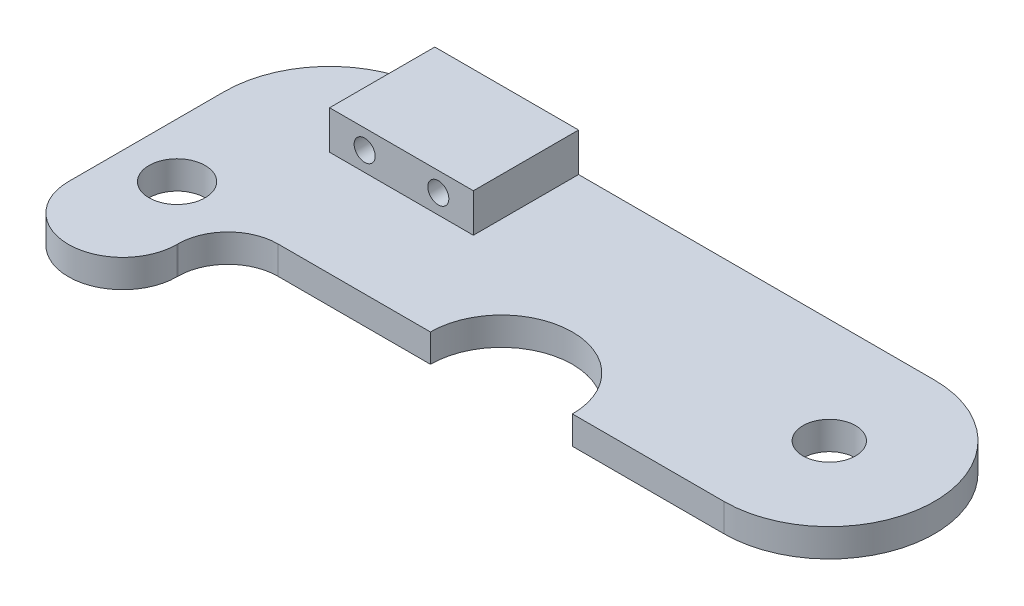
ISO-10303-21;
HEADER;
FILE_DESCRIPTION(('STEP AP214'),'2;1');
FILE_NAME('part.step','',(''),(''),'','','');
FILE_SCHEMA(('AUTOMOTIVE_DESIGN { 1 0 10303 214 1 1 1 1 }'));
ENDSEC;
DATA;
#1=APPLICATION_CONTEXT('core data for automotive mechanical design processes');
#2=APPLICATION_PROTOCOL_DEFINITION('international standard','automotive_design',2000,#1);
#3=PRODUCT_CONTEXT('',#1,'mechanical');
#4=PRODUCT('Part','Part','',(#3));
#5=PRODUCT_RELATED_PRODUCT_CATEGORY('part','',(#4));
#6=PRODUCT_DEFINITION_FORMATION('','',#4);
#7=PRODUCT_DEFINITION_CONTEXT('part definition',#1,'design');
#8=PRODUCT_DEFINITION('design','',#6,#7);
#9=PRODUCT_DEFINITION_SHAPE('','',#8);
#10=(LENGTH_UNIT() NAMED_UNIT(*) SI_UNIT(.MILLI.,.METRE.));
#11=(NAMED_UNIT(*) PLANE_ANGLE_UNIT() SI_UNIT($,.RADIAN.));
#12=(NAMED_UNIT(*) SI_UNIT($,.STERADIAN.) SOLID_ANGLE_UNIT());
#13=UNCERTAINTY_MEASURE_WITH_UNIT(LENGTH_MEASURE(1.E-05),#10,'distance_accuracy_value','');
#14=(GEOMETRIC_REPRESENTATION_CONTEXT(3) GLOBAL_UNCERTAINTY_ASSIGNED_CONTEXT((#13)) GLOBAL_UNIT_ASSIGNED_CONTEXT((#10,
#11,#12)) REPRESENTATION_CONTEXT('',''));
#15=CARTESIAN_POINT('',(0.,0.,0.));
#16=DIRECTION('',(0.,0.,1.));
#17=DIRECTION('',(1.,0.,0.));
#18=AXIS2_PLACEMENT_3D('',#15,#16,#17);
#19=CARTESIAN_POINT('',(-12.8703818547243,8.8,-15.7021496849741));
#20=DIRECTION('',(0.,1.,0.));
#21=DIRECTION('',(0.,0.,1.));
#22=AXIS2_PLACEMENT_3D('',#19,#20,#21);
#23=PLANE('',#22);
#24=DIRECTION('',(0.,0.,1.));
#25=VECTOR('',#24,1.);
#26=CARTESIAN_POINT('',(-12.8703818547243,8.8,-21.7021496849741));
#27=LINE('',#26,#25);
#28=CARTESIAN_POINT('',(-12.8703818547243,8.8,-21.7021496849741));
#29=VERTEX_POINT('',#28);
#30=CARTESIAN_POINT('',(-12.8703818547243,8.8,-15.7021496849741));
#31=VERTEX_POINT('',#30);
#32=EDGE_CURVE('E154',#29,#31,#27,.T.);
#33=ORIENTED_EDGE('',*,*,#32,.F.);
#34=CARTESIAN_POINT('',(-12.8703818547243,8.8,-15.7021496849741));
#35=DIRECTION('',(0.,1.,0.));
#36=DIRECTION('',(0.,0.,1.));
#37=AXIS2_PLACEMENT_3D('',#34,#35,#36);
#38=CIRCLE('',#37,6.);
#39=CARTESIAN_POINT('',(-18.8703818547243,8.8,-15.7021496849741));
#40=VERTEX_POINT('',#39);
#41=EDGE_CURVE('E173',#29,#40,#38,.T.);
#42=ORIENTED_EDGE('',*,*,#41,.T.);
#43=DIRECTION('',(0.,0.,1.));
#44=VECTOR('',#43,1.);
#45=CARTESIAN_POINT('',(-18.8703818547243,8.8,-9.70214968497411));
#46=LINE('',#45,#44);
#47=CARTESIAN_POINT('',(-18.8703818547243,8.8,-6.80214968497411));
#48=VERTEX_POINT('',#47);
#49=EDGE_CURVE('E176',#40,#48,#46,.T.);
#50=ORIENTED_EDGE('',*,*,#49,.T.);
#51=CARTESIAN_POINT('',(-15.7703818547243,8.8,-6.80214968497411));
#52=DIRECTION('',(0.,1.,0.));
#53=DIRECTION('',(0.,0.,1.));
#54=AXIS2_PLACEMENT_3D('',#51,#52,#53);
#55=CIRCLE('',#54,3.1);
#56=CARTESIAN_POINT('',(-12.6703818547243,8.8,-6.80214968497411));
#57=VERTEX_POINT('',#56);
#58=EDGE_CURVE('E179',#48,#57,#55,.T.);
#59=ORIENTED_EDGE('',*,*,#58,.T.);
#60=DIRECTION('',(0.,0.,-1.));
#61=VECTOR('',#60,1.);
#62=CARTESIAN_POINT('',(-12.6703818547243,8.8,-6.85214968497411));
#63=LINE('',#62,#61);
#64=CARTESIAN_POINT('',(-12.6703818547243,8.8,-6.85214968497411));
#65=VERTEX_POINT('',#64);
#66=EDGE_CURVE('E181',#57,#65,#63,.T.);
#67=ORIENTED_EDGE('',*,*,#66,.T.);
#68=CARTESIAN_POINT('',(-9.82038185472429,8.8,-6.85214968497411));
#69=DIRECTION('',(0.,-1.,0.));
#70=DIRECTION('',(0.,0.,1.));
#71=AXIS2_PLACEMENT_3D('',#68,#69,#70);
#72=CIRCLE('',#71,2.85);
#73=CARTESIAN_POINT('',(-9.82038185472429,8.8,-9.70214968497411));
#74=VERTEX_POINT('',#73);
#75=EDGE_CURVE('E183',#65,#74,#72,.T.);
#76=ORIENTED_EDGE('',*,*,#75,.T.);
#77=DIRECTION('',(1.,0.,0.));
#78=VECTOR('',#77,1.);
#79=CARTESIAN_POINT('',(-9.82038185472429,8.8,-9.70214968497411));
#80=LINE('',#79,#78);
#81=CARTESIAN_POINT('',(-1.12038185472429,8.8,-9.70214968497411));
#82=VERTEX_POINT('',#81);
#83=EDGE_CURVE('E185',#74,#82,#80,.T.);
#84=ORIENTED_EDGE('',*,*,#83,.T.);
#85=CARTESIAN_POINT('',(2.92961814527571,8.8,-9.70214968497411));
#86=DIRECTION('',(0.,-1.,0.));
#87=DIRECTION('',(0.,0.,1.));
#88=AXIS2_PLACEMENT_3D('',#85,#86,#87);
#89=CIRCLE('',#88,4.05);
#90=CARTESIAN_POINT('',(6.97961814527571,8.8,-9.70214968497411));
#91=VERTEX_POINT('',#90);
#92=EDGE_CURVE('E187',#82,#91,#89,.T.);
#93=ORIENTED_EDGE('',*,*,#92,.T.);
#94=DIRECTION('',(1.,0.,0.));
#95=VECTOR('',#94,1.);
#96=CARTESIAN_POINT('',(6.97961814527571,8.8,-9.70214968497411));
#97=LINE('',#96,#95);
#98=CARTESIAN_POINT('',(15.6296181452757,8.8,-9.70214968497411));
#99=VERTEX_POINT('',#98);
#100=EDGE_CURVE('E189',#91,#99,#97,.T.);
#101=ORIENTED_EDGE('',*,*,#100,.T.);
#102=CARTESIAN_POINT('',(15.6296181452757,8.8,-15.7021496849741));
#103=DIRECTION('',(0.,1.,0.));
#104=DIRECTION('',(0.,0.,1.));
#105=AXIS2_PLACEMENT_3D('',#102,#103,#104);
#106=CIRCLE('',#105,6.);
#107=CARTESIAN_POINT('',(15.6296181452757,8.8,-21.7021496849741));
#108=VERTEX_POINT('',#107);
#109=EDGE_CURVE('E191',#99,#108,#106,.T.);
#110=ORIENTED_EDGE('',*,*,#109,.T.);
#111=DIRECTION('',(-1.,0.,0.));
#112=VECTOR('',#111,1.);
#113=CARTESIAN_POINT('',(-12.8703818547243,8.8,-21.7021496849741));
#114=LINE('',#113,#112);
#115=CARTESIAN_POINT('',(-4.6703818547243,8.8,-21.7021496849741));
#116=VERTEX_POINT('',#115);
#117=EDGE_CURVE('E56',#108,#116,#114,.T.);
#118=ORIENTED_EDGE('',*,*,#117,.T.);
#119=DIRECTION('',(0.,0.,-1.));
#120=VECTOR('',#119,1.);
#121=CARTESIAN_POINT('',(-4.6703818547243,8.8,-21.7021496849741));
#122=LINE('',#121,#120);
#123=CARTESIAN_POINT('',(-4.67038185472429,8.8,-15.7021496849741));
#124=VERTEX_POINT('',#123);
#125=EDGE_CURVE('E151',#124,#116,#122,.T.);
#126=ORIENTED_EDGE('',*,*,#125,.F.);
#127=DIRECTION('',(1.,0.,0.));
#128=VECTOR('',#127,1.);
#129=CARTESIAN_POINT('',(-12.8703818547243,8.8,-15.7021496849741));
#130=LINE('',#129,#128);
#131=EDGE_CURVE('E50',#31,#124,#130,.T.);
#132=ORIENTED_EDGE('',*,*,#131,.F.);
#133=EDGE_LOOP('',(#33,#42,#50,#59,#67,#76,#84,#93,#101,#110,#118,#126,#132));
#134=FACE_BOUND('',#133,.T.);
#135=CARTESIAN_POINT('',(15.6296181452757,8.8,-15.7021496849741));
#136=DIRECTION('',(0.,1.,0.));
#137=DIRECTION('',(0.,0.,1.));
#138=AXIS2_PLACEMENT_3D('',#135,#136,#137);
#139=CIRCLE('',#138,1.5);
#140=CARTESIAN_POINT('',(15.6296181452757,8.8,-14.2021496849741));
#141=VERTEX_POINT('',#140);
#142=EDGE_CURVE('E167',#141,#141,#139,.T.);
#143=ORIENTED_EDGE('',*,*,#142,.F.);
#144=EDGE_LOOP('',(#143));
#145=FACE_BOUND('',#144,.T.);
#146=CARTESIAN_POINT('',(-15.7703818547243,8.8,-9.90214968497411));
#147=DIRECTION('',(0.,1.,0.));
#148=DIRECTION('',(0.,0.,1.));
#149=AXIS2_PLACEMENT_3D('',#146,#147,#148);
#150=CIRCLE('',#149,1.6);
#151=CARTESIAN_POINT('',(-15.7703818547243,8.8,-8.30214968497411));
#152=VERTEX_POINT('',#151);
#153=EDGE_CURVE('E158',#152,#152,#150,.T.);
#154=ORIENTED_EDGE('',*,*,#153,.F.);
#155=EDGE_LOOP('',(#154));
#156=FACE_BOUND('',#155,.T.);
#157=ADVANCED_FACE('F35',(#134,#145,#156),#23,.T.);
#158=CARTESIAN_POINT('',(-12.8703818547243,7.2,-15.7021496849741));
#159=DIRECTION('',(0.,1.,0.));
#160=DIRECTION('',(0.,0.,1.));
#161=AXIS2_PLACEMENT_3D('',#158,#159,#160);
#162=PLANE('',#161);
#163=CARTESIAN_POINT('',(-12.8703818547243,7.2,-15.7021496849741));
#164=DIRECTION('',(0.,1.,0.));
#165=DIRECTION('',(0.,0.,1.));
#166=AXIS2_PLACEMENT_3D('',#163,#164,#165);
#167=CIRCLE('',#166,6.);
#168=CARTESIAN_POINT('',(-12.8703818547243,7.2,-21.7021496849741));
#169=VERTEX_POINT('',#168);
#170=CARTESIAN_POINT('',(-18.8703818547243,7.2,-15.7021496849741));
#171=VERTEX_POINT('',#170);
#172=EDGE_CURVE('E170',#169,#171,#167,.T.);
#173=ORIENTED_EDGE('',*,*,#172,.F.);
#174=DIRECTION('',(-1.,0.,0.));
#175=VECTOR('',#174,1.);
#176=CARTESIAN_POINT('',(-12.8703818547243,7.2,-21.7021496849741));
#177=LINE('',#176,#175);
#178=CARTESIAN_POINT('',(15.6296181452757,7.2,-21.7021496849741));
#179=VERTEX_POINT('',#178);
#180=EDGE_CURVE('E177',#179,#169,#177,.T.);
#181=ORIENTED_EDGE('',*,*,#180,.F.);
#182=CARTESIAN_POINT('',(15.6296181452757,7.2,-15.7021496849741));
#183=DIRECTION('',(0.,1.,0.));
#184=DIRECTION('',(0.,0.,1.));
#185=AXIS2_PLACEMENT_3D('',#182,#183,#184);
#186=CIRCLE('',#185,6.);
#187=CARTESIAN_POINT('',(15.6296181452757,7.2,-9.70214968497411));
#188=VERTEX_POINT('',#187);
#189=EDGE_CURVE('E211',#188,#179,#186,.T.);
#190=ORIENTED_EDGE('',*,*,#189,.F.);
#191=DIRECTION('',(1.,0.,0.));
#192=VECTOR('',#191,1.);
#193=CARTESIAN_POINT('',(6.97961814527571,7.2,-9.70214968497411));
#194=LINE('',#193,#192);
#195=CARTESIAN_POINT('',(6.97961814527571,7.2,-9.70214968497411));
#196=VERTEX_POINT('',#195);
#197=EDGE_CURVE('E209',#196,#188,#194,.T.);
#198=ORIENTED_EDGE('',*,*,#197,.F.);
#199=CARTESIAN_POINT('',(2.92961814527571,7.2,-9.70214968497411));
#200=DIRECTION('',(0.,-1.,0.));
#201=DIRECTION('',(0.,0.,1.));
#202=AXIS2_PLACEMENT_3D('',#199,#200,#201);
#203=CIRCLE('',#202,4.05);
#204=CARTESIAN_POINT('',(-1.12038185472429,7.2,-9.70214968497411));
#205=VERTEX_POINT('',#204);
#206=EDGE_CURVE('E207',#205,#196,#203,.T.);
#207=ORIENTED_EDGE('',*,*,#206,.F.);
#208=DIRECTION('',(1.,0.,0.));
#209=VECTOR('',#208,1.);
#210=CARTESIAN_POINT('',(-9.82038185472429,7.2,-9.70214968497411));
#211=LINE('',#210,#209);
#212=CARTESIAN_POINT('',(-9.82038185472429,7.2,-9.70214968497411));
#213=VERTEX_POINT('',#212);
#214=EDGE_CURVE('E205',#213,#205,#211,.T.);
#215=ORIENTED_EDGE('',*,*,#214,.F.);
#216=CARTESIAN_POINT('',(-9.82038185472429,7.2,-6.85214968497411));
#217=DIRECTION('',(0.,-1.,0.));
#218=DIRECTION('',(0.,0.,1.));
#219=AXIS2_PLACEMENT_3D('',#216,#217,#218);
#220=CIRCLE('',#219,2.85);
#221=CARTESIAN_POINT('',(-12.6703818547243,7.2,-6.85214968497411));
#222=VERTEX_POINT('',#221);
#223=EDGE_CURVE('E203',#222,#213,#220,.T.);
#224=ORIENTED_EDGE('',*,*,#223,.F.);
#225=DIRECTION('',(0.,0.,-1.));
#226=VECTOR('',#225,1.);
#227=CARTESIAN_POINT('',(-12.6703818547243,7.2,-6.85214968497411));
#228=LINE('',#227,#226);
#229=CARTESIAN_POINT('',(-12.6703818547243,7.2,-6.80214968497411));
#230=VERTEX_POINT('',#229);
#231=EDGE_CURVE('E201',#230,#222,#228,.T.);
#232=ORIENTED_EDGE('',*,*,#231,.F.);
#233=CARTESIAN_POINT('',(-15.7703818547243,7.2,-6.80214968497411));
#234=DIRECTION('',(0.,1.,0.));
#235=DIRECTION('',(0.,0.,1.));
#236=AXIS2_PLACEMENT_3D('',#233,#234,#235);
#237=CIRCLE('',#236,3.1);
#238=CARTESIAN_POINT('',(-18.8703818547243,7.2,-6.80214968497411));
#239=VERTEX_POINT('',#238);
#240=EDGE_CURVE('E199',#239,#230,#237,.T.);
#241=ORIENTED_EDGE('',*,*,#240,.F.);
#242=DIRECTION('',(0.,0.,1.));
#243=VECTOR('',#242,1.);
#244=CARTESIAN_POINT('',(-18.8703818547243,7.2,-9.70214968497411));
#245=LINE('',#244,#243);
#246=EDGE_CURVE('E197',#171,#239,#245,.T.);
#247=ORIENTED_EDGE('',*,*,#246,.F.);
#248=EDGE_LOOP('',(#173,#181,#190,#198,#207,#215,#224,#232,#241,#247));
#249=FACE_BOUND('',#248,.T.);
#250=CARTESIAN_POINT('',(15.6296181452757,7.2,-15.7021496849741));
#251=DIRECTION('',(0.,1.,0.));
#252=DIRECTION('',(0.,0.,1.));
#253=AXIS2_PLACEMENT_3D('',#250,#251,#252);
#254=CIRCLE('',#253,1.5);
#255=CARTESIAN_POINT('',(15.6296181452757,7.2,-14.2021496849741));
#256=VERTEX_POINT('',#255);
#257=EDGE_CURVE('E165',#256,#256,#254,.T.);
#258=ORIENTED_EDGE('',*,*,#257,.T.);
#259=EDGE_LOOP('',(#258));
#260=FACE_BOUND('',#259,.T.);
#261=CARTESIAN_POINT('',(-15.7703818547243,7.2,-9.90214968497411));
#262=DIRECTION('',(0.,1.,0.));
#263=DIRECTION('',(0.,0.,1.));
#264=AXIS2_PLACEMENT_3D('',#261,#262,#263);
#265=CIRCLE('',#264,1.6);
#266=CARTESIAN_POINT('',(-15.7703818547243,7.2,-8.30214968497411));
#267=VERTEX_POINT('',#266);
#268=EDGE_CURVE('E155',#267,#267,#265,.T.);
#269=ORIENTED_EDGE('',*,*,#268,.T.);
#270=EDGE_LOOP('',(#269));
#271=FACE_BOUND('',#270,.T.);
#272=ADVANCED_FACE('F247',(#249,#260,#271),#162,.F.);
#273=CARTESIAN_POINT('',(-12.8703818547243,8.8,-15.7021496849741));
#274=DIRECTION('',(0.,-1.,0.));
#275=DIRECTION('',(0.,0.,-1.));
#276=AXIS2_PLACEMENT_3D('',#273,#274,#275);
#277=CYLINDRICAL_SURFACE('',#276,6.);
#278=ORIENTED_EDGE('',*,*,#172,.T.);
#279=DIRECTION('',(0.,-1.,0.));
#280=VECTOR('',#279,1.);
#281=CARTESIAN_POINT('',(-18.8703818547243,8.8,-15.7021496849741));
#282=LINE('',#281,#280);
#283=EDGE_CURVE('E11',#40,#171,#282,.T.);
#284=ORIENTED_EDGE('',*,*,#283,.F.);
#285=ORIENTED_EDGE('',*,*,#41,.F.);
#286=DIRECTION('',(0.,-1.,0.));
#287=VECTOR('',#286,1.);
#288=CARTESIAN_POINT('',(-12.8703818547243,8.8,-21.7021496849741));
#289=LINE('',#288,#287);
#290=EDGE_CURVE('E194',#29,#169,#289,.T.);
#291=ORIENTED_EDGE('',*,*,#290,.T.);
#292=EDGE_LOOP('',(#278,#284,#285,#291));
#293=FACE_BOUND('',#292,.T.);
#294=ADVANCED_FACE('F37',(#293),#277,.T.);
#295=CARTESIAN_POINT('',(-18.8703818547243,8.8,-9.70214968497411));
#296=DIRECTION('',(1.,0.,0.));
#297=DIRECTION('',(0.,0.,-1.));
#298=AXIS2_PLACEMENT_3D('',#295,#296,#297);
#299=PLANE('',#298);
#300=ORIENTED_EDGE('',*,*,#246,.T.);
#301=DIRECTION('',(0.,-1.,0.));
#302=VECTOR('',#301,1.);
#303=CARTESIAN_POINT('',(-18.8703818547243,8.8,-6.80214968497411));
#304=LINE('',#303,#302);
#305=EDGE_CURVE('E43',#48,#239,#304,.T.);
#306=ORIENTED_EDGE('',*,*,#305,.F.);
#307=ORIENTED_EDGE('',*,*,#49,.F.);
#308=ORIENTED_EDGE('',*,*,#283,.T.);
#309=EDGE_LOOP('',(#300,#306,#307,#308));
#310=FACE_BOUND('',#309,.T.);
#311=ADVANCED_FACE('F264',(#310),#299,.F.);
#312=CARTESIAN_POINT('',(-15.7703818547243,8.8,-6.80214968497411));
#313=DIRECTION('',(0.,-1.,0.));
#314=DIRECTION('',(0.,0.,-1.));
#315=AXIS2_PLACEMENT_3D('',#312,#313,#314);
#316=CYLINDRICAL_SURFACE('',#315,3.1);
#317=ORIENTED_EDGE('',*,*,#240,.T.);
#318=DIRECTION('',(0.,-1.,0.));
#319=VECTOR('',#318,1.);
#320=CARTESIAN_POINT('',(-12.6703818547243,8.8,-6.80214968497411));
#321=LINE('',#320,#319);
#322=EDGE_CURVE('E234',#57,#230,#321,.T.);
#323=ORIENTED_EDGE('',*,*,#322,.F.);
#324=ORIENTED_EDGE('',*,*,#58,.F.);
#325=ORIENTED_EDGE('',*,*,#305,.T.);
#326=EDGE_LOOP('',(#317,#323,#324,#325));
#327=FACE_BOUND('',#326,.T.);
#328=ADVANCED_FACE('F241',(#327),#316,.T.);
#329=CARTESIAN_POINT('',(-12.6703818547243,8.8,-6.85214968497411));
#330=DIRECTION('',(-1.,0.,0.));
#331=DIRECTION('',(0.,0.,1.));
#332=AXIS2_PLACEMENT_3D('',#329,#330,#331);
#333=PLANE('',#332);
#334=ORIENTED_EDGE('',*,*,#231,.T.);
#335=DIRECTION('',(0.,-1.,0.));
#336=VECTOR('',#335,1.);
#337=CARTESIAN_POINT('',(-12.6703818547243,8.8,-6.85214968497411));
#338=LINE('',#337,#336);
#339=EDGE_CURVE('E231',#65,#222,#338,.T.);
#340=ORIENTED_EDGE('',*,*,#339,.F.);
#341=ORIENTED_EDGE('',*,*,#66,.F.);
#342=ORIENTED_EDGE('',*,*,#322,.T.);
#343=EDGE_LOOP('',(#334,#340,#341,#342));
#344=FACE_BOUND('',#343,.T.);
#345=ADVANCED_FACE('F253',(#344),#333,.F.);
#346=CARTESIAN_POINT('',(-9.82038185472429,8.8,-6.85214968497411));
#347=DIRECTION('',(0.,-1.,0.));
#348=DIRECTION('',(0.,0.,-1.));
#349=AXIS2_PLACEMENT_3D('',#346,#347,#348);
#350=CYLINDRICAL_SURFACE('',#349,2.85);
#351=ORIENTED_EDGE('',*,*,#223,.T.);
#352=DIRECTION('',(0.,-1.,0.));
#353=VECTOR('',#352,1.);
#354=CARTESIAN_POINT('',(-9.82038185472429,8.8,-9.70214968497411));
#355=LINE('',#354,#353);
#356=EDGE_CURVE('E228',#74,#213,#355,.T.);
#357=ORIENTED_EDGE('',*,*,#356,.F.);
#358=ORIENTED_EDGE('',*,*,#75,.F.);
#359=ORIENTED_EDGE('',*,*,#339,.T.);
#360=EDGE_LOOP('',(#351,#357,#358,#359));
#361=FACE_BOUND('',#360,.T.);
#362=ADVANCED_FACE('F257',(#361),#350,.F.);
#363=CARTESIAN_POINT('',(-9.82038185472429,8.8,-9.70214968497411));
#364=DIRECTION('',(0.,0.,-1.));
#365=DIRECTION('',(-1.,0.,0.));
#366=AXIS2_PLACEMENT_3D('',#363,#364,#365);
#367=PLANE('',#366);
#368=ORIENTED_EDGE('',*,*,#214,.T.);
#369=DIRECTION('',(0.,-1.,0.));
#370=VECTOR('',#369,1.);
#371=CARTESIAN_POINT('',(-1.12038185472429,8.8,-9.70214968497411));
#372=LINE('',#371,#370);
#373=EDGE_CURVE('E225',#82,#205,#372,.T.);
#374=ORIENTED_EDGE('',*,*,#373,.F.);
#375=ORIENTED_EDGE('',*,*,#83,.F.);
#376=ORIENTED_EDGE('',*,*,#356,.T.);
#377=EDGE_LOOP('',(#368,#374,#375,#376));
#378=FACE_BOUND('',#377,.T.);
#379=ADVANCED_FACE('F287',(#378),#367,.F.);
#380=CARTESIAN_POINT('',(2.92961814527571,8.8,-9.70214968497411));
#381=DIRECTION('',(0.,-1.,0.));
#382=DIRECTION('',(0.,0.,-1.));
#383=AXIS2_PLACEMENT_3D('',#380,#381,#382);
#384=CYLINDRICAL_SURFACE('',#383,4.05);
#385=ORIENTED_EDGE('',*,*,#206,.T.);
#386=DIRECTION('',(0.,-1.,0.));
#387=VECTOR('',#386,1.);
#388=CARTESIAN_POINT('',(6.97961814527571,8.8,-9.70214968497411));
#389=LINE('',#388,#387);
#390=EDGE_CURVE('E222',#91,#196,#389,.T.);
#391=ORIENTED_EDGE('',*,*,#390,.F.);
#392=ORIENTED_EDGE('',*,*,#92,.F.);
#393=ORIENTED_EDGE('',*,*,#373,.T.);
#394=EDGE_LOOP('',(#385,#391,#392,#393));
#395=FACE_BOUND('',#394,.T.);
#396=ADVANCED_FACE('F284',(#395),#384,.F.);
#397=CARTESIAN_POINT('',(6.97961814527571,8.8,-9.70214968497411));
#398=DIRECTION('',(0.,0.,-1.));
#399=DIRECTION('',(-1.,0.,0.));
#400=AXIS2_PLACEMENT_3D('',#397,#398,#399);
#401=PLANE('',#400);
#402=ORIENTED_EDGE('',*,*,#197,.T.);
#403=DIRECTION('',(0.,-1.,0.));
#404=VECTOR('',#403,1.);
#405=CARTESIAN_POINT('',(15.6296181452757,8.8,-9.70214968497411));
#406=LINE('',#405,#404);
#407=EDGE_CURVE('E219',#99,#188,#406,.T.);
#408=ORIENTED_EDGE('',*,*,#407,.F.);
#409=ORIENTED_EDGE('',*,*,#100,.F.);
#410=ORIENTED_EDGE('',*,*,#390,.T.);
#411=EDGE_LOOP('',(#402,#408,#409,#410));
#412=FACE_BOUND('',#411,.T.);
#413=ADVANCED_FACE('F280',(#412),#401,.F.);
#414=CARTESIAN_POINT('',(15.6296181452757,8.8,-15.7021496849741));
#415=DIRECTION('',(0.,-1.,0.));
#416=DIRECTION('',(0.,0.,-1.));
#417=AXIS2_PLACEMENT_3D('',#414,#415,#416);
#418=CYLINDRICAL_SURFACE('',#417,6.);
#419=ORIENTED_EDGE('',*,*,#189,.T.);
#420=DIRECTION('',(0.,-1.,0.));
#421=VECTOR('',#420,1.);
#422=CARTESIAN_POINT('',(15.6296181452757,8.8,-21.7021496849741));
#423=LINE('',#422,#421);
#424=EDGE_CURVE('E216',#108,#179,#423,.T.);
#425=ORIENTED_EDGE('',*,*,#424,.F.);
#426=ORIENTED_EDGE('',*,*,#109,.F.);
#427=ORIENTED_EDGE('',*,*,#407,.T.);
#428=EDGE_LOOP('',(#419,#425,#426,#427));
#429=FACE_BOUND('',#428,.T.);
#430=ADVANCED_FACE('F276',(#429),#418,.T.);
#431=CARTESIAN_POINT('',(-12.8703818547243,8.8,-21.7021496849741));
#432=DIRECTION('',(0.,0.,1.));
#433=DIRECTION('',(1.,0.,0.));
#434=AXIS2_PLACEMENT_3D('',#431,#432,#433);
#435=PLANE('',#434);
#436=CARTESIAN_POINT('',(-6.67038185472429,9.9,-21.7021496849741));
#437=DIRECTION('',(0.,0.,-1.));
#438=DIRECTION('',(-1.,0.,0.));
#439=AXIS2_PLACEMENT_3D('',#436,#437,#438);
#440=CIRCLE('',#439,0.6);
#441=CARTESIAN_POINT('',(-7.27038185472429,9.9,-21.7021496849741));
#442=VERTEX_POINT('',#441);
#443=EDGE_CURVE('E467',#442,#442,#440,.T.);
#444=ORIENTED_EDGE('',*,*,#443,.F.);
#445=EDGE_LOOP('',(#444));
#446=FACE_BOUND('',#445,.T.);
#447=CARTESIAN_POINT('',(-10.8703818547243,9.9,-21.7021496849741));
#448=DIRECTION('',(0.,0.,-1.));
#449=DIRECTION('',(-1.,0.,0.));
#450=AXIS2_PLACEMENT_3D('',#447,#448,#449);
#451=CIRCLE('',#450,0.6);
#452=CARTESIAN_POINT('',(-11.4703818547243,9.9,-21.7021496849741));
#453=VERTEX_POINT('',#452);
#454=EDGE_CURVE('E476',#453,#453,#451,.T.);
#455=ORIENTED_EDGE('',*,*,#454,.F.);
#456=EDGE_LOOP('',(#455));
#457=FACE_BOUND('',#456,.T.);
#458=ORIENTED_EDGE('',*,*,#180,.T.);
#459=ORIENTED_EDGE('',*,*,#290,.F.);
#460=DIRECTION('',(0.,-1.,0.));
#461=VECTOR('',#460,1.);
#462=CARTESIAN_POINT('',(-12.8703818547243,11.,-21.7021496849741));
#463=LINE('',#462,#461);
#464=CARTESIAN_POINT('',(-12.8703818547243,11.,-21.7021496849741));
#465=VERTEX_POINT('',#464);
#466=EDGE_CURVE('E482',#465,#29,#463,.T.);
#467=ORIENTED_EDGE('',*,*,#466,.F.);
#468=DIRECTION('',(-1.,0.,0.));
#469=VECTOR('',#468,1.);
#470=CARTESIAN_POINT('',(-12.8703818547243,11.,-21.7021496849741));
#471=LINE('',#470,#469);
#472=CARTESIAN_POINT('',(-4.6703818547243,11.,-21.7021496849741));
#473=VERTEX_POINT('',#472);
#474=EDGE_CURVE('E147',#473,#465,#471,.T.);
#475=ORIENTED_EDGE('',*,*,#474,.F.);
#476=DIRECTION('',(0.,-1.,0.));
#477=VECTOR('',#476,1.);
#478=CARTESIAN_POINT('',(-4.6703818547243,11.,-21.7021496849741));
#479=LINE('',#478,#477);
#480=EDGE_CURVE('E160',#473,#116,#479,.T.);
#481=ORIENTED_EDGE('',*,*,#480,.T.);
#482=ORIENTED_EDGE('',*,*,#117,.F.);
#483=ORIENTED_EDGE('',*,*,#424,.T.);
#484=EDGE_LOOP('',(#458,#459,#467,#475,#481,#482,#483));
#485=FACE_BOUND('',#484,.T.);
#486=ADVANCED_FACE('F271',(#446,#457,#485),#435,.F.);
#487=CARTESIAN_POINT('',(15.6296181452757,8.8,-15.7021496849741));
#488=DIRECTION('',(0.,-1.,0.));
#489=DIRECTION('',(0.,0.,-1.));
#490=AXIS2_PLACEMENT_3D('',#487,#488,#489);
#491=CYLINDRICAL_SURFACE('',#490,1.5);
#492=ORIENTED_EDGE('',*,*,#142,.T.);
#493=EDGE_LOOP('',(#492));
#494=FACE_BOUND('',#493,.T.);
#495=ORIENTED_EDGE('',*,*,#257,.F.);
#496=EDGE_LOOP('',(#495));
#497=FACE_BOUND('',#496,.T.);
#498=ADVANCED_FACE('F303',(#494,#497),#491,.F.);
#499=CARTESIAN_POINT('',(-15.7703818547243,8.8,-9.90214968497411));
#500=DIRECTION('',(0.,-1.,0.));
#501=DIRECTION('',(0.,0.,-1.));
#502=AXIS2_PLACEMENT_3D('',#499,#500,#501);
#503=CYLINDRICAL_SURFACE('',#502,1.6);
#504=ORIENTED_EDGE('',*,*,#153,.T.);
#505=EDGE_LOOP('',(#504));
#506=FACE_BOUND('',#505,.T.);
#507=ORIENTED_EDGE('',*,*,#268,.F.);
#508=EDGE_LOOP('',(#507));
#509=FACE_BOUND('',#508,.T.);
#510=ADVANCED_FACE('F332',(#506,#509),#503,.F.);
#511=CARTESIAN_POINT('',(-12.8703818547243,11.,-21.7021496849741));
#512=DIRECTION('',(1.,0.,0.));
#513=DIRECTION('',(0.,0.,-1.));
#514=AXIS2_PLACEMENT_3D('',#511,#512,#513);
#515=PLANE('',#514);
#516=ORIENTED_EDGE('',*,*,#32,.T.);
#517=DIRECTION('',(0.,-1.,0.));
#518=VECTOR('',#517,1.);
#519=CARTESIAN_POINT('',(-12.8703818547243,11.,-15.7021496849741));
#520=LINE('',#519,#518);
#521=CARTESIAN_POINT('',(-12.8703818547243,11.,-15.7021496849741));
#522=VERTEX_POINT('',#521);
#523=EDGE_CURVE('E135',#522,#31,#520,.T.);
#524=ORIENTED_EDGE('',*,*,#523,.F.);
#525=DIRECTION('',(0.,0.,1.));
#526=VECTOR('',#525,1.);
#527=CARTESIAN_POINT('',(-12.8703818547243,11.,-21.7021496849741));
#528=LINE('',#527,#526);
#529=EDGE_CURVE('E142',#465,#522,#528,.T.);
#530=ORIENTED_EDGE('',*,*,#529,.F.);
#531=ORIENTED_EDGE('',*,*,#466,.T.);
#532=EDGE_LOOP('',(#516,#524,#530,#531));
#533=FACE_BOUND('',#532,.T.);
#534=ADVANCED_FACE('F153',(#533),#515,.F.);
#535=CARTESIAN_POINT('',(-12.8703818547243,11.,-15.7021496849741));
#536=DIRECTION('',(0.,0.,-1.));
#537=DIRECTION('',(-1.,0.,0.));
#538=AXIS2_PLACEMENT_3D('',#535,#536,#537);
#539=PLANE('',#538);
#540=CARTESIAN_POINT('',(-6.67038185472429,9.9,-15.7021496849741));
#541=DIRECTION('',(0.,0.,-1.));
#542=DIRECTION('',(-1.,0.,0.));
#543=AXIS2_PLACEMENT_3D('',#540,#541,#542);
#544=CIRCLE('',#543,0.6);
#545=CARTESIAN_POINT('',(-7.27038185472429,9.9,-15.7021496849741));
#546=VERTEX_POINT('',#545);
#547=EDGE_CURVE('E470',#546,#546,#544,.F.);
#548=ORIENTED_EDGE('',*,*,#547,.F.);
#549=EDGE_LOOP('',(#548));
#550=FACE_BOUND('',#549,.T.);
#551=CARTESIAN_POINT('',(-10.8703818547243,9.9,-15.7021496849741));
#552=DIRECTION('',(0.,0.,-1.));
#553=DIRECTION('',(-1.,0.,0.));
#554=AXIS2_PLACEMENT_3D('',#551,#552,#553);
#555=CIRCLE('',#554,0.6);
#556=CARTESIAN_POINT('',(-11.4703818547243,9.9,-15.7021496849741));
#557=VERTEX_POINT('',#556);
#558=EDGE_CURVE('E473',#557,#557,#555,.F.);
#559=ORIENTED_EDGE('',*,*,#558,.F.);
#560=EDGE_LOOP('',(#559));
#561=FACE_BOUND('',#560,.T.);
#562=ORIENTED_EDGE('',*,*,#131,.T.);
#563=DIRECTION('',(0.,-1.,0.));
#564=VECTOR('',#563,1.);
#565=CARTESIAN_POINT('',(-4.67038185472429,11.,-15.7021496849741));
#566=LINE('',#565,#564);
#567=CARTESIAN_POINT('',(-4.67038185472429,11.,-15.7021496849741));
#568=VERTEX_POINT('',#567);
#569=EDGE_CURVE('E138',#568,#124,#566,.T.);
#570=ORIENTED_EDGE('',*,*,#569,.F.);
#571=DIRECTION('',(1.,0.,0.));
#572=VECTOR('',#571,1.);
#573=CARTESIAN_POINT('',(-12.8703818547243,11.,-15.7021496849741));
#574=LINE('',#573,#572);
#575=EDGE_CURVE('E131',#522,#568,#574,.T.);
#576=ORIENTED_EDGE('',*,*,#575,.F.);
#577=ORIENTED_EDGE('',*,*,#523,.T.);
#578=EDGE_LOOP('',(#562,#570,#576,#577));
#579=FACE_BOUND('',#578,.T.);
#580=ADVANCED_FACE('F133',(#550,#561,#579),#539,.F.);
#581=CARTESIAN_POINT('',(-4.6703818547243,11.,-21.7021496849741));
#582=DIRECTION('',(-1.,0.,0.));
#583=DIRECTION('',(0.,0.,1.));
#584=AXIS2_PLACEMENT_3D('',#581,#582,#583);
#585=PLANE('',#584);
#586=ORIENTED_EDGE('',*,*,#125,.T.);
#587=ORIENTED_EDGE('',*,*,#480,.F.);
#588=DIRECTION('',(0.,0.,-1.));
#589=VECTOR('',#588,1.);
#590=CARTESIAN_POINT('',(-4.6703818547243,11.,-21.7021496849741));
#591=LINE('',#590,#589);
#592=EDGE_CURVE('E141',#568,#473,#591,.T.);
#593=ORIENTED_EDGE('',*,*,#592,.F.);
#594=ORIENTED_EDGE('',*,*,#569,.T.);
#595=EDGE_LOOP('',(#586,#587,#593,#594));
#596=FACE_BOUND('',#595,.T.);
#597=ADVANCED_FACE('F352',(#596),#585,.F.);
#598=CARTESIAN_POINT('',(0.,11.,0.));
#599=DIRECTION('',(0.,1.,0.));
#600=DIRECTION('',(0.,0.,1.));
#601=AXIS2_PLACEMENT_3D('',#598,#599,#600);
#602=PLANE('',#601);
#603=ORIENTED_EDGE('',*,*,#529,.T.);
#604=ORIENTED_EDGE('',*,*,#575,.T.);
#605=ORIENTED_EDGE('',*,*,#592,.T.);
#606=ORIENTED_EDGE('',*,*,#474,.T.);
#607=EDGE_LOOP('',(#603,#604,#605,#606));
#608=FACE_BOUND('',#607,.T.);
#609=ADVANCED_FACE('F145',(#608),#602,.T.);
#610=CARTESIAN_POINT('',(-10.8703818547243,9.9,-3.70114968497411));
#611=DIRECTION('',(0.,0.,-1.));
#612=DIRECTION('',(-1.,0.,0.));
#613=AXIS2_PLACEMENT_3D('',#610,#611,#612);
#614=CYLINDRICAL_SURFACE('',#613,0.6);
#615=ORIENTED_EDGE('',*,*,#454,.T.);
#616=EDGE_LOOP('',(#615));
#617=FACE_BOUND('',#616,.T.);
#618=ORIENTED_EDGE('',*,*,#558,.T.);
#619=EDGE_LOOP('',(#618));
#620=FACE_BOUND('',#619,.T.);
#621=ADVANCED_FACE('F366',(#617,#620),#614,.F.);
#622=CARTESIAN_POINT('',(-6.67038185472429,9.9,-3.70114968497411));
#623=DIRECTION('',(0.,0.,-1.));
#624=DIRECTION('',(-1.,0.,0.));
#625=AXIS2_PLACEMENT_3D('',#622,#623,#624);
#626=CYLINDRICAL_SURFACE('',#625,0.6);
#627=ORIENTED_EDGE('',*,*,#443,.T.);
#628=EDGE_LOOP('',(#627));
#629=FACE_BOUND('',#628,.T.);
#630=ORIENTED_EDGE('',*,*,#547,.T.);
#631=EDGE_LOOP('',(#630));
#632=FACE_BOUND('',#631,.T.);
#633=ADVANCED_FACE('F372',(#629,#632),#626,.F.);
#634=CLOSED_SHELL('',(#157,#272,#294,#311,#328,#345,#362,#379,#396,#413,#430,#486,#498,#510,
#534,#580,#597,#609,#621,#633));
#635=MANIFOLD_SOLID_BREP('B2',#634);
#636=ADVANCED_BREP_SHAPE_REPRESENTATION('',(#18,#635),#14);
#637=SHAPE_DEFINITION_REPRESENTATION(#9,#636);
ENDSEC;
END-ISO-10303-21;
